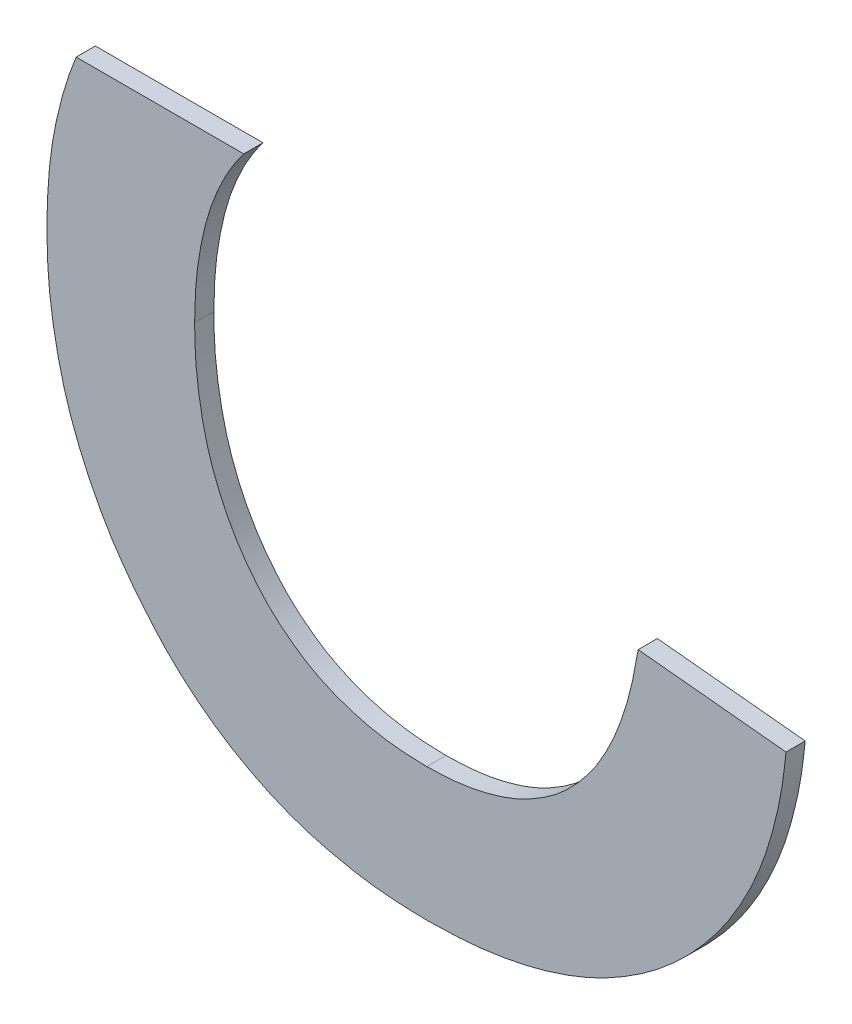
ISO-10303-21;
HEADER;
FILE_DESCRIPTION(('STEP AP214'),'2;1');
FILE_NAME('part.step','',(''),(''),'','','');
FILE_SCHEMA(('AUTOMOTIVE_DESIGN { 1 0 10303 214 1 1 1 1 }'));
ENDSEC;
DATA;
#1=APPLICATION_CONTEXT('core data for automotive mechanical design processes');
#2=APPLICATION_PROTOCOL_DEFINITION('international standard','automotive_design',2000,#1);
#3=PRODUCT_CONTEXT('',#1,'mechanical');
#4=PRODUCT('Part','Part','',(#3));
#5=PRODUCT_RELATED_PRODUCT_CATEGORY('part','',(#4));
#6=PRODUCT_DEFINITION_FORMATION('','',#4);
#7=PRODUCT_DEFINITION_CONTEXT('part definition',#1,'design');
#8=PRODUCT_DEFINITION('design','',#6,#7);
#9=PRODUCT_DEFINITION_SHAPE('','',#8);
#10=(LENGTH_UNIT() NAMED_UNIT(*) SI_UNIT(.MILLI.,.METRE.));
#11=(NAMED_UNIT(*) PLANE_ANGLE_UNIT() SI_UNIT($,.RADIAN.));
#12=(NAMED_UNIT(*) SI_UNIT($,.STERADIAN.) SOLID_ANGLE_UNIT());
#13=UNCERTAINTY_MEASURE_WITH_UNIT(LENGTH_MEASURE(1.E-05),#10,'distance_accuracy_value','');
#14=(GEOMETRIC_REPRESENTATION_CONTEXT(3) GLOBAL_UNCERTAINTY_ASSIGNED_CONTEXT((#13)) GLOBAL_UNIT_ASSIGNED_CONTEXT((#10,
#11,#12)) REPRESENTATION_CONTEXT('',''));
#15=CARTESIAN_POINT('',(0.,0.,0.));
#16=DIRECTION('',(0.,0.,1.));
#17=DIRECTION('',(1.,0.,0.));
#18=AXIS2_PLACEMENT_3D('',#15,#16,#17);
#19=CARTESIAN_POINT('',(0.270432692307709,-11.9230769230769,0.5));
#20=CARTESIAN_POINT('',(0.0417624850556169,-11.917551587077,0.5));
#21=CARTESIAN_POINT('',(-0.405412068221499,-11.9067465517943,0.5));
#22=CARTESIAN_POINT('',(-1.05596633519065,-11.8153619044994,0.5));
#23=CARTESIAN_POINT('',(-1.67046752789383,-11.6646792082309,0.5));
#24=CARTESIAN_POINT('',(-2.24597535159053,-11.4538099684877,0.5));
#25=CARTESIAN_POINT('',(-2.78923651972976,-11.1915691177577,0.5));
#26=CARTESIAN_POINT('',(-3.2822286741977,-10.8520149861326,0.5));
#27=CARTESIAN_POINT('',(-3.75183246427989,-10.4703225904718,0.5));
#28=CARTESIAN_POINT('',(-4.16782877969731,-10.0152719997556,0.5));
#29=CARTESIAN_POINT('',(-4.54650230418646,-9.51987342113349,0.5));
#30=CARTESIAN_POINT('',(-4.87332602438313,-8.97912479930914,0.5));
#31=CARTESIAN_POINT('',(-5.14846542112891,-8.40061596912319,0.5));
#32=CARTESIAN_POINT('',(-5.38010272037981,-7.78445784138785,0.5));
#33=CARTESIAN_POINT('',(-5.55114996205856,-7.12713051853561,0.5));
#34=CARTESIAN_POINT('',(-5.67696902461543,-6.43213085657785,0.5));
#35=CARTESIAN_POINT('',(-5.75773984020727,-5.69901614006801,0.5));
#36=CARTESIAN_POINT('',(-5.76534614363091,-5.19652948922153,0.5));
#37=CARTESIAN_POINT('',(-5.76923076923075,-4.93990384615385,0.5));
#38=B_SPLINE_CURVE_WITH_KNOTS('',3,(#19,#20,#21,#22,#23,#24,#25,#26,#27,#28,#29,#30,#31,#32,#33,
#34,#35,#36,#37),.UNSPECIFIED.,.F.,.F.,(4,1,1,1,1,1,1,1,1,1,1,1,1,1,1,1,4),(0.,
0.065801037609473,0.128676795948973,0.188675874952433,0.247598436733894,0.304849420118827,
0.361785899282899,0.419522706368589,0.478681815420741,0.538769503044019,0.598799056013154,
0.660184281500679,0.722951530610966,0.787992689104874,0.855403768434473,0.926153061284004,1.),.UNSPECIFIED.);
#39=DIRECTION('',(0.,0.,-1.));
#40=VECTOR('',#39,1.);
#41=SURFACE_OF_LINEAR_EXTRUSION('',#38,#40);
#42=CARTESIAN_POINT('',(0.270432692307709,-11.9230769230769,0.));
#43=CARTESIAN_POINT('',(0.0417624850556169,-11.917551587077,0.));
#44=CARTESIAN_POINT('',(-0.405412068221499,-11.9067465517943,0.));
#45=CARTESIAN_POINT('',(-1.05596633519065,-11.8153619044994,0.));
#46=CARTESIAN_POINT('',(-1.67046752789383,-11.6646792082309,0.));
#47=CARTESIAN_POINT('',(-2.24597535159053,-11.4538099684877,0.));
#48=CARTESIAN_POINT('',(-2.78923651972976,-11.1915691177577,0.));
#49=CARTESIAN_POINT('',(-3.2822286741977,-10.8520149861326,0.));
#50=CARTESIAN_POINT('',(-3.75183246427989,-10.4703225904718,0.));
#51=CARTESIAN_POINT('',(-4.16782877969731,-10.0152719997556,0.));
#52=CARTESIAN_POINT('',(-4.54650230418646,-9.51987342113349,0.));
#53=CARTESIAN_POINT('',(-4.87332602438313,-8.97912479930914,0.));
#54=CARTESIAN_POINT('',(-5.14846542112891,-8.40061596912319,0.));
#55=CARTESIAN_POINT('',(-5.38010272037981,-7.78445784138785,0.));
#56=CARTESIAN_POINT('',(-5.55114996205856,-7.12713051853561,0.));
#57=CARTESIAN_POINT('',(-5.67696902461543,-6.43213085657785,0.));
#58=CARTESIAN_POINT('',(-5.75773984020727,-5.69901614006801,0.));
#59=CARTESIAN_POINT('',(-5.76534614363091,-5.19652948922153,0.));
#60=CARTESIAN_POINT('',(-5.76923076923075,-4.93990384615385,0.));
#61=B_SPLINE_CURVE_WITH_KNOTS('',3,(#42,#43,#44,#45,#46,#47,#48,#49,#50,#51,#52,#53,#54,#55,#56,
#57,#58,#59,#60),.UNSPECIFIED.,.F.,.F.,(4,1,1,1,1,1,1,1,1,1,1,1,1,1,1,1,4),(0.,
0.065801037609473,0.128676795948973,0.188675874952433,0.247598436733894,0.304849420118827,
0.361785899282899,0.419522706368589,0.478681815420741,0.538769503044019,0.598799056013154,
0.660184281500679,0.722951530610966,0.787992689104874,0.855403768434473,0.926153061284004,1.),.UNSPECIFIED.);
#62=CARTESIAN_POINT('',(0.270432692307709,-11.9230769230769,0.));
#63=VERTEX_POINT('',#62);
#64=CARTESIAN_POINT('',(-5.76923076923075,-4.93990384615385,0.));
#65=VERTEX_POINT('',#64);
#66=EDGE_CURVE('E133',#63,#65,#61,.T.);
#67=ORIENTED_EDGE('',*,*,#66,.T.);
#68=DIRECTION('',(0.,0.,-1.));
#69=VECTOR('',#68,1.);
#70=CARTESIAN_POINT('',(-5.76923076923075,-4.93990384615385,0.5));
#71=LINE('',#70,#69);
#72=CARTESIAN_POINT('',(-5.76923076923075,-4.93990384615385,0.5));
#73=VERTEX_POINT('',#72);
#74=EDGE_CURVE('E47',#73,#65,#71,.T.);
#75=ORIENTED_EDGE('',*,*,#74,.F.);
#76=CARTESIAN_POINT('',(0.270432692307709,-11.9230769230769,0.5));
#77=VERTEX_POINT('',#76);
#78=EDGE_CURVE('E120',#77,#73,#38,.T.);
#79=ORIENTED_EDGE('',*,*,#78,.F.);
#80=DIRECTION('',(0.,0.,-1.));
#81=VECTOR('',#80,1.);
#82=CARTESIAN_POINT('',(0.270432692307709,-11.9230769230769,0.5));
#83=LINE('',#82,#81);
#84=EDGE_CURVE('E139',#77,#63,#83,.T.);
#85=ORIENTED_EDGE('',*,*,#84,.T.);
#86=EDGE_LOOP('',(#67,#75,#79,#85));
#87=FACE_BOUND('',#86,.T.);
#88=ADVANCED_FACE('F39',(#87),#41,.F.);
#89=CARTESIAN_POINT('',(5.76923076923079,-6.53846153846154,0.5));
#90=CARTESIAN_POINT('',(5.73114780791335,-6.75517119915605,0.5));
#91=CARTESIAN_POINT('',(5.65707052531692,-7.17670519287129,0.5));
#92=CARTESIAN_POINT('',(5.51590807620132,-7.78688815181148,0.5));
#93=CARTESIAN_POINT('',(5.33257823763546,-8.35376517604529,0.5));
#94=CARTESIAN_POINT('',(5.12658698056486,-8.88224574438043,0.5));
#95=CARTESIAN_POINT('',(4.88173162002967,-9.36674183653039,0.5));
#96=CARTESIAN_POINT('',(4.61642880827824,-9.81490339234355,0.5));
#97=CARTESIAN_POINT('',(4.30355836171512,-10.2108220736664,0.5));
#98=CARTESIAN_POINT('',(3.97461709511748,-10.5752048009428,0.5));
#99=CARTESIAN_POINT('',(3.61357892053754,-10.8962904255207,0.5));
#100=CARTESIAN_POINT('',(3.21696008990652,-11.1669766839051,0.5));
#101=CARTESIAN_POINT('',(2.79582652860781,-11.4031340532196,0.5));
#102=CARTESIAN_POINT('',(2.34504898861967,-11.5964892154392,0.5));
#103=CARTESIAN_POINT('',(1.86393660085663,-11.7380150111599,0.5));
#104=CARTESIAN_POINT('',(1.35861264025595,-11.8499376195799,0.5));
#105=CARTESIAN_POINT('',(0.822570146584102,-11.9063348940974,0.5));
#106=CARTESIAN_POINT('',(0.456832011709617,-11.9174248833846,0.5));
#107=CARTESIAN_POINT('',(0.270432692307709,-11.9230769230769,0.5));
#108=B_SPLINE_CURVE_WITH_KNOTS('',3,(#89,#90,#91,#92,#93,#94,#95,#96,#97,#98,#99,#100,#101,#102,
#103,#104,#105,#106,#107),.UNSPECIFIED.,.F.,.F.,(4,1,1,1,1,1,1,1,1,1,1,1,1,1,1,1,4),(0.,
0.077361337118976,0.150479832280681,0.219977236852074,0.286680996862441,0.349678494185663,
0.410679625017485,0.469427113519291,0.526755701427129,0.583141980834837,0.638824427778626,
0.695263470403812,0.752695804898535,0.810849183334895,0.871356303636084,0.934436430984128,1.),.UNSPECIFIED.);
#109=DIRECTION('',(0.,0.,-1.));
#110=VECTOR('',#109,1.);
#111=SURFACE_OF_LINEAR_EXTRUSION('',#108,#110);
#112=CARTESIAN_POINT('',(5.76923076923079,-6.53846153846154,0.));
#113=CARTESIAN_POINT('',(5.73114780791335,-6.75517119915605,0.));
#114=CARTESIAN_POINT('',(5.65707052531692,-7.17670519287129,0.));
#115=CARTESIAN_POINT('',(5.51590807620132,-7.78688815181148,0.));
#116=CARTESIAN_POINT('',(5.33257823763546,-8.35376517604529,0.));
#117=CARTESIAN_POINT('',(5.12658698056486,-8.88224574438043,0.));
#118=CARTESIAN_POINT('',(4.88173162002967,-9.36674183653039,0.));
#119=CARTESIAN_POINT('',(4.61642880827824,-9.81490339234355,0.));
#120=CARTESIAN_POINT('',(4.30355836171512,-10.2108220736664,0.));
#121=CARTESIAN_POINT('',(3.97461709511748,-10.5752048009428,0.));
#122=CARTESIAN_POINT('',(3.61357892053754,-10.8962904255207,0.));
#123=CARTESIAN_POINT('',(3.21696008990652,-11.1669766839051,0.));
#124=CARTESIAN_POINT('',(2.79582652860781,-11.4031340532196,0.));
#125=CARTESIAN_POINT('',(2.34504898861967,-11.5964892154392,0.));
#126=CARTESIAN_POINT('',(1.86393660085663,-11.7380150111599,0.));
#127=CARTESIAN_POINT('',(1.35861264025595,-11.8499376195799,0.));
#128=CARTESIAN_POINT('',(0.822570146584102,-11.9063348940974,0.));
#129=CARTESIAN_POINT('',(0.456832011709617,-11.9174248833846,0.));
#130=CARTESIAN_POINT('',(0.270432692307709,-11.9230769230769,0.));
#131=B_SPLINE_CURVE_WITH_KNOTS('',3,(#112,#113,#114,#115,#116,#117,#118,#119,#120,#121,#122,
#123,#124,#125,#126,#127,#128,#129,#130),.UNSPECIFIED.,.F.,.F.,(4,1,1,1,1,1,1,1,1,1,1,1,1,1,1,1,
4),(0.,0.077361337118976,0.150479832280681,0.219977236852074,0.286680996862441,
0.349678494185663,0.410679625017485,0.469427113519291,0.526755701427129,0.583141980834837,
0.638824427778626,0.695263470403812,0.752695804898535,0.810849183334895,0.871356303636084,
0.934436430984128,1.),.UNSPECIFIED.);
#132=CARTESIAN_POINT('',(5.76923076923079,-6.53846153846154,0.));
#133=VERTEX_POINT('',#132);
#134=EDGE_CURVE('E141',#133,#63,#131,.T.);
#135=ORIENTED_EDGE('',*,*,#134,.T.);
#136=ORIENTED_EDGE('',*,*,#84,.F.);
#137=CARTESIAN_POINT('',(5.76923076923079,-6.53846153846154,0.5));
#138=VERTEX_POINT('',#137);
#139=EDGE_CURVE('E215',#138,#77,#108,.T.);
#140=ORIENTED_EDGE('',*,*,#139,.F.);
#141=DIRECTION('',(0.,0.,-1.));
#142=VECTOR('',#141,1.);
#143=CARTESIAN_POINT('',(5.76923076923079,-6.53846153846154,0.5));
#144=LINE('',#143,#142);
#145=EDGE_CURVE('E149',#138,#133,#144,.T.);
#146=ORIENTED_EDGE('',*,*,#145,.T.);
#147=EDGE_LOOP('',(#135,#136,#140,#146));
#148=FACE_BOUND('',#147,.T.);
#149=ADVANCED_FACE('F199',(#148),#111,.F.);
#150=CARTESIAN_POINT('',(9.61538461538463,-6.92307692307692,0.5));
#151=DIRECTION('',(-0.0995037190209988,-0.995037190209989,0.));
#152=DIRECTION('',(0.995037190209989,-0.0995037190209988,0.));
#153=AXIS2_PLACEMENT_3D('',#150,#151,#152);
#154=PLANE('',#153);
#155=DIRECTION('',(-0.995037190209989,0.0995037190209988,0.));
#156=VECTOR('',#155,1.);
#157=CARTESIAN_POINT('',(9.61538461538463,-6.92307692307692,0.));
#158=LINE('',#157,#156);
#159=CARTESIAN_POINT('',(9.61538461538463,-6.92307692307692,0.));
#160=VERTEX_POINT('',#159);
#161=EDGE_CURVE('E146',#160,#133,#158,.T.);
#162=ORIENTED_EDGE('',*,*,#161,.T.);
#163=ORIENTED_EDGE('',*,*,#145,.F.);
#164=DIRECTION('',(-0.995037190209989,0.0995037190209988,0.));
#165=VECTOR('',#164,1.);
#166=CARTESIAN_POINT('',(9.61538461538463,-6.92307692307692,0.5));
#167=LINE('',#166,#165);
#168=CARTESIAN_POINT('',(9.61538461538463,-6.92307692307692,0.5));
#169=VERTEX_POINT('',#168);
#170=EDGE_CURVE('E226',#169,#138,#167,.T.);
#171=ORIENTED_EDGE('',*,*,#170,.F.);
#172=DIRECTION('',(0.,0.,-1.));
#173=VECTOR('',#172,1.);
#174=CARTESIAN_POINT('',(9.61538461538463,-6.92307692307692,0.5));
#175=LINE('',#174,#173);
#176=EDGE_CURVE('E151',#169,#160,#175,.T.);
#177=ORIENTED_EDGE('',*,*,#176,.T.);
#178=EDGE_LOOP('',(#162,#163,#171,#177));
#179=FACE_BOUND('',#178,.T.);
#180=ADVANCED_FACE('F204',(#179),#154,.F.);
#181=CARTESIAN_POINT('',(0.29447115384617,-15.3846153846154,0.5));
#182=CARTESIAN_POINT('',(0.61731387141956,-15.3780665727163,0.5));
#183=CARTESIAN_POINT('',(1.24885903131316,-15.3652557820967,0.5));
#184=CARTESIAN_POINT('',(2.17355351170966,-15.2538848362444,0.5));
#185=CARTESIAN_POINT('',(3.05304730892502,-15.0762874483541,0.5));
#186=CARTESIAN_POINT('',(3.88761595397978,-14.8215578161983,0.5));
#187=CARTESIAN_POINT('',(4.67977377825226,-14.4996830873233,0.5));
#188=CARTESIAN_POINT('',(5.42031297856914,-14.090791812185,0.5));
#189=CARTESIAN_POINT('',(6.12208481478024,-13.6230456610166,0.5));
#190=CARTESIAN_POINT('',(6.76965264526119,-13.0820334611229,0.5));
#191=CARTESIAN_POINT('',(7.35967125324576,-12.4785968679024,0.5));
#192=CARTESIAN_POINT('',(7.88833990873537,-11.8255214022307,0.5));
#193=CARTESIAN_POINT('',(8.34850428445516,-11.1223812112496,0.5));
#194=CARTESIAN_POINT('',(8.7399422827429,-10.3733837299701,0.5));
#195=CARTESIAN_POINT('',(9.06618777879945,-9.57924726779194,0.5));
#196=CARTESIAN_POINT('',(9.31577848213798,-8.73455154014438,0.5));
#197=CARTESIAN_POINT('',(9.51347508967043,-7.84758431312007,0.5));
#198=CARTESIAN_POINT('',(9.58105859121429,-7.23447728328738,0.5));
#199=CARTESIAN_POINT('',(9.61538461538463,-6.92307692307693,0.5));
#200=B_SPLINE_CURVE_WITH_KNOTS('',3,(#181,#182,#183,#184,#185,#186,#187,#188,#189,#190,#191,
#192,#193,#194,#195,#196,#197,#198,#199),.UNSPECIFIED.,.F.,.F.,(4,1,1,1,1,1,1,1,1,1,1,1,1,1,1,1,
4),(0.,0.0692980234597532,0.135560844101282,0.199670955647057,0.261716238495609,
0.322661929947103,0.382906923778225,0.443032033072891,0.503500787350163,0.563724281017108,
0.623980022053474,0.683629386995523,0.743848272485731,0.80519184622951,0.867648742959767,
0.932778084231261,1.),.UNSPECIFIED.);
#201=DIRECTION('',(0.,0.,-1.));
#202=VECTOR('',#201,1.);
#203=SURFACE_OF_LINEAR_EXTRUSION('',#200,#202);
#204=CARTESIAN_POINT('',(0.29447115384617,-15.3846153846154,0.));
#205=CARTESIAN_POINT('',(0.61731387141956,-15.3780665727163,0.));
#206=CARTESIAN_POINT('',(1.24885903131316,-15.3652557820967,0.));
#207=CARTESIAN_POINT('',(2.17355351170966,-15.2538848362444,0.));
#208=CARTESIAN_POINT('',(3.05304730892502,-15.0762874483541,0.));
#209=CARTESIAN_POINT('',(3.88761595397978,-14.8215578161983,0.));
#210=CARTESIAN_POINT('',(4.67977377825226,-14.4996830873233,0.));
#211=CARTESIAN_POINT('',(5.42031297856914,-14.090791812185,0.));
#212=CARTESIAN_POINT('',(6.12208481478024,-13.6230456610166,0.));
#213=CARTESIAN_POINT('',(6.76965264526119,-13.0820334611229,0.));
#214=CARTESIAN_POINT('',(7.35967125324576,-12.4785968679024,0.));
#215=CARTESIAN_POINT('',(7.88833990873537,-11.8255214022307,0.));
#216=CARTESIAN_POINT('',(8.34850428445516,-11.1223812112496,0.));
#217=CARTESIAN_POINT('',(8.7399422827429,-10.3733837299701,0.));
#218=CARTESIAN_POINT('',(9.06618777879945,-9.57924726779194,0.));
#219=CARTESIAN_POINT('',(9.31577848213798,-8.73455154014438,0.));
#220=CARTESIAN_POINT('',(9.51347508967043,-7.84758431312007,0.));
#221=CARTESIAN_POINT('',(9.58105859121429,-7.23447728328738,0.));
#222=CARTESIAN_POINT('',(9.61538461538463,-6.92307692307693,0.));
#223=B_SPLINE_CURVE_WITH_KNOTS('',3,(#204,#205,#206,#207,#208,#209,#210,#211,#212,#213,#214,
#215,#216,#217,#218,#219,#220,#221,#222),.UNSPECIFIED.,.F.,.F.,(4,1,1,1,1,1,1,1,1,1,1,1,1,1,1,1,
4),(0.,0.0692980234597532,0.135560844101282,0.199670955647057,0.261716238495609,
0.322661929947103,0.382906923778225,0.443032033072891,0.503500787350163,0.563724281017108,
0.623980022053474,0.683629386995523,0.743848272485731,0.80519184622951,0.867648742959767,
0.932778084231261,1.),.UNSPECIFIED.);
#224=CARTESIAN_POINT('',(0.294471153846169,-15.3846153846154,0.));
#225=VERTEX_POINT('',#224);
#226=EDGE_CURVE('E153',#225,#160,#223,.T.);
#227=ORIENTED_EDGE('',*,*,#226,.T.);
#228=ORIENTED_EDGE('',*,*,#176,.F.);
#229=CARTESIAN_POINT('',(0.294471153846169,-15.3846153846154,0.5));
#230=VERTEX_POINT('',#229);
#231=EDGE_CURVE('E170',#230,#169,#200,.T.);
#232=ORIENTED_EDGE('',*,*,#231,.F.);
#233=DIRECTION('',(0.,0.,-1.));
#234=VECTOR('',#233,1.);
#235=CARTESIAN_POINT('',(0.294471153846169,-15.3846153846154,0.5));
#236=LINE('',#235,#234);
#237=EDGE_CURVE('E158',#230,#225,#236,.T.);
#238=ORIENTED_EDGE('',*,*,#237,.T.);
#239=EDGE_LOOP('',(#227,#228,#232,#238));
#240=FACE_BOUND('',#239,.T.);
#241=ADVANCED_FACE('F182',(#240),#203,.F.);
#242=CARTESIAN_POINT('',(-7.31971153846152,-11.7427884615385,0.5));
#243=CARTESIAN_POINT('',(-7.08405216502034,-12.0333533217631,0.5));
#244=CARTESIAN_POINT('',(-6.62048487621668,-12.604925597922,0.5));
#245=CARTESIAN_POINT('',(-5.81782317590183,-13.3467922023177,0.5));
#246=CARTESIAN_POINT('',(-4.95495046796258,-13.977276717126,0.5));
#247=CARTESIAN_POINT('',(-4.0267316921085,-14.4894996933801,0.5));
#248=CARTESIAN_POINT('',(-3.03939828138436,-14.9011142294698,0.5));
#249=CARTESIAN_POINT('',(-1.98082111549329,-15.1750282472766,0.5));
#250=CARTESIAN_POINT('',(-0.863791278364023,-15.3589723601052,0.5));
#251=CARTESIAN_POINT('',(-0.0969286227070843,-15.3759500996296,0.5));
#252=CARTESIAN_POINT('',(0.294471153846169,-15.3846153846154,0.5));
#253=B_SPLINE_CURVE_WITH_KNOTS('',3,(#242,#243,#244,#245,#246,#247,#248,#249,#250,#251,#252),
.UNSPECIFIED.,.F.,.F.,(4,1,1,1,1,1,1,1,4),(0.,0.127892619465421,0.251578513503857,
0.372792819702304,0.492777698607854,0.613590069242572,0.737808649280146,0.866179901539168,1.),.UNSPECIFIED.);
#254=DIRECTION('',(0.,0.,-1.));
#255=VECTOR('',#254,1.);
#256=SURFACE_OF_LINEAR_EXTRUSION('',#253,#255);
#257=CARTESIAN_POINT('',(-7.31971153846152,-11.7427884615385,0.));
#258=CARTESIAN_POINT('',(-7.08405216502034,-12.0333533217631,0.));
#259=CARTESIAN_POINT('',(-6.62048487621668,-12.604925597922,0.));
#260=CARTESIAN_POINT('',(-5.81782317590183,-13.3467922023177,0.));
#261=CARTESIAN_POINT('',(-4.95495046796258,-13.977276717126,0.));
#262=CARTESIAN_POINT('',(-4.0267316921085,-14.4894996933801,0.));
#263=CARTESIAN_POINT('',(-3.03939828138436,-14.9011142294698,0.));
#264=CARTESIAN_POINT('',(-1.98082111549329,-15.1750282472766,0.));
#265=CARTESIAN_POINT('',(-0.863791278364023,-15.3589723601052,0.));
#266=CARTESIAN_POINT('',(-0.0969286227070843,-15.3759500996296,0.));
#267=CARTESIAN_POINT('',(0.294471153846169,-15.3846153846154,0.));
#268=B_SPLINE_CURVE_WITH_KNOTS('',3,(#257,#258,#259,#260,#261,#262,#263,#264,#265,#266,#267),
.UNSPECIFIED.,.F.,.F.,(4,1,1,1,1,1,1,1,4),(0.,0.127892619465421,0.251578513503857,
0.372792819702304,0.492777698607854,0.613590069242572,0.737808649280146,0.866179901539168,1.),.UNSPECIFIED.);
#269=CARTESIAN_POINT('',(-7.31971153846152,-11.7427884615385,0.));
#270=VERTEX_POINT('',#269);
#271=EDGE_CURVE('E272',#270,#225,#268,.T.);
#272=ORIENTED_EDGE('',*,*,#271,.T.);
#273=ORIENTED_EDGE('',*,*,#237,.F.);
#274=CARTESIAN_POINT('',(-7.31971153846152,-11.7427884615385,0.5));
#275=VERTEX_POINT('',#274);
#276=EDGE_CURVE('E162',#275,#230,#253,.T.);
#277=ORIENTED_EDGE('',*,*,#276,.F.);
#278=DIRECTION('',(0.,0.,-1.));
#279=VECTOR('',#278,1.);
#280=CARTESIAN_POINT('',(-7.31971153846152,-11.7427884615385,0.5));
#281=LINE('',#280,#279);
#282=EDGE_CURVE('E271',#275,#270,#281,.T.);
#283=ORIENTED_EDGE('',*,*,#282,.T.);
#284=EDGE_LOOP('',(#272,#273,#277,#283));
#285=FACE_BOUND('',#284,.T.);
#286=ADVANCED_FACE('F177',(#285),#256,.F.);
#287=CARTESIAN_POINT('',(-9.6153846153846,-4.71153846153846,0.5));
#288=CARTESIAN_POINT('',(-9.60857463018898,-5.04435423593501,0.5));
#289=CARTESIAN_POINT('',(-9.59512296624039,-5.70176035729509,0.5));
#290=CARTESIAN_POINT('',(-9.48488379805219,-6.67056980722342,0.5));
#291=CARTESIAN_POINT('',(-9.30329096780913,-7.60409396778952,0.5));
#292=CARTESIAN_POINT('',(-9.06018827641446,-8.50509729113863,0.5));
#293=CARTESIAN_POINT('',(-8.73172391614789,-9.36846277539103,0.5));
#294=CARTESIAN_POINT('',(-8.3333273914149,-10.1969791610731,0.5));
#295=CARTESIAN_POINT('',(-7.87375465390775,-10.9992917361114,0.5));
#296=CARTESIAN_POINT('',(-7.50520116776095,-11.493871133374,0.5));
#297=CARTESIAN_POINT('',(-7.31971153846152,-11.7427884615385,0.5));
#298=B_SPLINE_CURVE_WITH_KNOTS('',3,(#287,#288,#289,#290,#291,#292,#293,#294,#295,#296,#297),
.UNSPECIFIED.,.F.,.F.,(4,1,1,1,1,1,1,1,4),(0.,0.132461622242638,0.26164950103549,
0.387546698416366,0.510781629293347,0.632675360599711,0.754660354138138,0.876522779802865,1.),.UNSPECIFIED.);
#299=DIRECTION('',(0.,0.,-1.));
#300=VECTOR('',#299,1.);
#301=SURFACE_OF_LINEAR_EXTRUSION('',#298,#300);
#302=CARTESIAN_POINT('',(-9.6153846153846,-4.71153846153846,0.));
#303=CARTESIAN_POINT('',(-9.60857463018898,-5.04435423593501,0.));
#304=CARTESIAN_POINT('',(-9.59512296624039,-5.70176035729509,0.));
#305=CARTESIAN_POINT('',(-9.48488379805219,-6.67056980722342,0.));
#306=CARTESIAN_POINT('',(-9.30329096780913,-7.60409396778952,0.));
#307=CARTESIAN_POINT('',(-9.06018827641446,-8.50509729113863,0.));
#308=CARTESIAN_POINT('',(-8.73172391614789,-9.36846277539103,0.));
#309=CARTESIAN_POINT('',(-8.3333273914149,-10.1969791610731,0.));
#310=CARTESIAN_POINT('',(-7.87375465390775,-10.9992917361114,0.));
#311=CARTESIAN_POINT('',(-7.50520116776095,-11.493871133374,0.));
#312=CARTESIAN_POINT('',(-7.31971153846152,-11.7427884615385,0.));
#313=B_SPLINE_CURVE_WITH_KNOTS('',3,(#302,#303,#304,#305,#306,#307,#308,#309,#310,#311,#312),
.UNSPECIFIED.,.F.,.F.,(4,1,1,1,1,1,1,1,4),(0.,0.132461622242638,0.26164950103549,
0.387546698416366,0.510781629293347,0.632675360599711,0.754660354138138,0.876522779802865,1.),.UNSPECIFIED.);
#314=CARTESIAN_POINT('',(-9.6153846153846,-4.71153846153846,0.));
#315=VERTEX_POINT('',#314);
#316=EDGE_CURVE('E122',#315,#270,#313,.T.);
#317=ORIENTED_EDGE('',*,*,#316,.T.);
#318=ORIENTED_EDGE('',*,*,#282,.F.);
#319=CARTESIAN_POINT('',(-9.6153846153846,-4.71153846153846,0.5));
#320=VERTEX_POINT('',#319);
#321=EDGE_CURVE('E169',#320,#275,#298,.T.);
#322=ORIENTED_EDGE('',*,*,#321,.F.);
#323=DIRECTION('',(0.,0.,-1.));
#324=VECTOR('',#323,1.);
#325=CARTESIAN_POINT('',(-9.6153846153846,-4.71153846153846,0.5));
#326=LINE('',#325,#324);
#327=EDGE_CURVE('E267',#320,#315,#326,.T.);
#328=ORIENTED_EDGE('',*,*,#327,.T.);
#329=EDGE_LOOP('',(#317,#318,#322,#328));
#330=FACE_BOUND('',#329,.T.);
#331=ADVANCED_FACE('F183',(#330),#301,.F.);
#332=CARTESIAN_POINT('',(6.72479436320556,-13.1040360063183,0.5));
#333=DIRECTION('',(0.,0.,-1.));
#334=DIRECTION('',(-1.,0.,0.));
#335=AXIS2_PLACEMENT_3D('',#332,#333,#334);
#336=PLANE('',#335);
#337=CARTESIAN_POINT('',(-5.76923076923075,-4.93990384615385,0.5));
#338=CARTESIAN_POINT('',(-5.76481556671325,-4.69534295230196,0.5));
#339=CARTESIAN_POINT('',(-5.75621814341022,-4.21912617187611,0.5));
#340=CARTESIAN_POINT('',(-5.68381381272763,-3.52567536035832,0.5));
#341=CARTESIAN_POINT('',(-5.56165918279042,-2.87362173974889,0.5));
#342=CARTESIAN_POINT('',(-5.40360252933254,-2.25577854103315,0.5));
#343=CARTESIAN_POINT('',(-5.18574136819858,-1.68180032511622,0.5));
#344=CARTESIAN_POINT('',(-4.92734576377249,-1.14336496905831,0.5));
#345=CARTESIAN_POINT('',(-4.61080028837524,-0.651899656303548,0.5));
#346=CARTESIAN_POINT('',(-4.25862255894378,-0.192101936840787,0.5));
#347=CARTESIAN_POINT('',(-3.85639112961883,0.220088191438074,0.5));
#348=CARTESIAN_POINT('',(-3.39867192137992,0.568130547046922,0.5));
#349=CARTESIAN_POINT('',(-2.9034209885128,0.872737896042509,0.5));
#350=CARTESIAN_POINT('',(-2.3606634698756,1.11975545357985,0.5));
#351=CARTESIAN_POINT('',(-1.77007976351094,1.30328021662253,0.5));
#352=CARTESIAN_POINT('',(-1.13753864408726,1.44448600800401,0.5));
#353=CARTESIAN_POINT('',(-0.456476560536233,1.51875447221429,0.5));
#354=CARTESIAN_POINT('',(0.0118653544143888,1.53177450360067,0.5));
#355=CARTESIAN_POINT('',(0.252403846153862,1.53846153846154,0.5));
#356=B_SPLINE_CURVE_WITH_KNOTS('',3,(#337,#338,#339,#340,#341,#342,#343,#344,#345,#346,#347,
#348,#349,#350,#351,#352,#353,#354,#355),.UNSPECIFIED.,.F.,.F.,(4,1,1,1,1,1,1,1,1,1,1,1,1,1,1,1,
4),(0.,0.0728659334565352,0.141886871964126,0.207452626414711,0.270437680000097,
0.331640872247669,0.390107577493158,0.448069286948836,0.505502951924537,0.562488152833724,
0.619084328884729,0.676415530692239,0.735452360450793,0.796240769448678,0.860405678089203,
0.928304927285106,1.),.UNSPECIFIED.);
#357=CARTESIAN_POINT('',(-4.49097708819802,-0.5,0.5));
#358=VERTEX_POINT('',#357);
#359=EDGE_CURVE('E214',#73,#358,#356,.T.);
#360=ORIENTED_EDGE('',*,*,#359,.T.);
#361=DIRECTION('',(-1.,0.,0.));
#362=VECTOR('',#361,1.);
#363=CARTESIAN_POINT('',(6.72479436320556,-0.5,0.5));
#364=LINE('',#363,#362);
#365=CARTESIAN_POINT('',(-8.85094215065557,-0.499999999585352,0.5));
#366=VERTEX_POINT('',#365);
#367=EDGE_CURVE('E476',#358,#366,#364,.T.);
#368=ORIENTED_EDGE('',*,*,#367,.T.);
#369=CARTESIAN_POINT('',(-0.81129807692306,5.,0.5));
#370=CARTESIAN_POINT('',(-1.1141988645718,4.99206375907898,0.5));
#371=CARTESIAN_POINT('',(-1.71068397645657,4.9764353759689,0.5));
#372=CARTESIAN_POINT('',(-2.58962544260301,4.8480285306234,0.5));
#373=CARTESIAN_POINT('',(-3.43004133811339,4.63004939817371,0.5));
#374=CARTESIAN_POINT('',(-4.2385238149774,4.336463286216,0.5));
#375=CARTESIAN_POINT('',(-5.00441208821668,3.94726474256061,0.5));
#376=CARTESIAN_POINT('',(-5.73546405515526,3.47602794776569,0.5));
#377=CARTESIAN_POINT('',(-6.42872820607369,2.91886862879422,0.5));
#378=CARTESIAN_POINT('',(-7.08028531926996,2.2862992321744,0.5));
#379=CARTESIAN_POINT('',(-7.67127353299072,1.58408070090461,0.5));
#380=CARTESIAN_POINT('',(-8.20022727277801,0.835114931584709,0.5));
#381=CARTESIAN_POINT('',(-8.63224779451468,0.0244096904560783,0.5));
#382=CARTESIAN_POINT('',(-8.99560670429197,-0.826867370101214,0.5));
#383=CARTESIAN_POINT('',(-9.26965977427216,-1.73269027221245,0.5));
#384=CARTESIAN_POINT('',(-9.477675619546,-2.68020353887867,0.5));
#385=CARTESIAN_POINT('',(-9.58889478622745,-3.68125324903562,0.5));
#386=CARTESIAN_POINT('',(-9.60641647528384,-4.36273507459891,0.5));
#387=CARTESIAN_POINT('',(-9.6153846153846,-4.71153846153846,0.5));
#388=B_SPLINE_CURVE_WITH_KNOTS('',3,(#369,#370,#371,#372,#373,#374,#375,#376,#377,#378,#379,
#380,#381,#382,#383,#384,#385,#386,#387),.UNSPECIFIED.,.F.,.F.,(4,1,1,1,1,1,1,1,1,1,1,1,1,1,1,1,
4),(0.,0.061997419075722,0.122087954082293,0.181375310787003,0.239508008395366,
0.297835697896751,0.356879970653118,0.417281825115428,0.479640409079816,0.542500067478357,
0.60496241964819,0.666991033078265,0.730216243010164,0.794172863251256,0.860458143150261,
0.928578179984783,1.),.UNSPECIFIED.);
#389=EDGE_CURVE('E119',#366,#320,#388,.T.);
#390=ORIENTED_EDGE('',*,*,#389,.T.);
#391=ORIENTED_EDGE('',*,*,#321,.T.);
#392=ORIENTED_EDGE('',*,*,#276,.T.);
#393=ORIENTED_EDGE('',*,*,#231,.T.);
#394=ORIENTED_EDGE('',*,*,#170,.T.);
#395=ORIENTED_EDGE('',*,*,#139,.T.);
#396=ORIENTED_EDGE('',*,*,#78,.T.);
#397=EDGE_LOOP('',(#360,#368,#390,#391,#392,#393,#394,#395,#396));
#398=FACE_BOUND('',#397,.T.);
#399=ADVANCED_FACE('F190',(#398),#336,.F.);
#400=DIRECTION('',(0.,0.,-1.));
#401=VECTOR('',#400,1.);
#402=SURFACE_OF_LINEAR_EXTRUSION('',#388,#401);
#403=ORIENTED_EDGE('',*,*,#389,.F.);
#404=DIRECTION('',(0.,0.,-1.));
#405=VECTOR('',#404,1.);
#406=CARTESIAN_POINT('',(-8.85094215082548,-0.5,0.5));
#407=LINE('',#406,#405);
#408=CARTESIAN_POINT('',(-8.85094215082548,-0.5,0.));
#409=VERTEX_POINT('',#408);
#410=EDGE_CURVE('E101',#366,#409,#407,.T.);
#411=ORIENTED_EDGE('',*,*,#410,.T.);
#412=CARTESIAN_POINT('',(-0.81129807692306,5.,0.));
#413=CARTESIAN_POINT('',(-1.1141988645718,4.99206375907898,0.));
#414=CARTESIAN_POINT('',(-1.71068397645657,4.9764353759689,0.));
#415=CARTESIAN_POINT('',(-2.58962544260301,4.8480285306234,0.));
#416=CARTESIAN_POINT('',(-3.43004133811339,4.63004939817371,0.));
#417=CARTESIAN_POINT('',(-4.2385238149774,4.336463286216,0.));
#418=CARTESIAN_POINT('',(-5.00441208821668,3.94726474256061,0.));
#419=CARTESIAN_POINT('',(-5.73546405515526,3.47602794776569,0.));
#420=CARTESIAN_POINT('',(-6.42872820607369,2.91886862879422,0.));
#421=CARTESIAN_POINT('',(-7.08028531926996,2.2862992321744,0.));
#422=CARTESIAN_POINT('',(-7.67127353299072,1.58408070090461,0.));
#423=CARTESIAN_POINT('',(-8.20022727277801,0.835114931584709,0.));
#424=CARTESIAN_POINT('',(-8.63224779451468,0.0244096904560783,0.));
#425=CARTESIAN_POINT('',(-8.99560670429197,-0.826867370101214,0.));
#426=CARTESIAN_POINT('',(-9.26965977427216,-1.73269027221245,0.));
#427=CARTESIAN_POINT('',(-9.477675619546,-2.68020353887867,0.));
#428=CARTESIAN_POINT('',(-9.58889478622745,-3.68125324903562,0.));
#429=CARTESIAN_POINT('',(-9.60641647528384,-4.36273507459891,0.));
#430=CARTESIAN_POINT('',(-9.6153846153846,-4.71153846153846,0.));
#431=B_SPLINE_CURVE_WITH_KNOTS('',3,(#412,#413,#414,#415,#416,#417,#418,#419,#420,#421,#422,
#423,#424,#425,#426,#427,#428,#429,#430),.UNSPECIFIED.,.F.,.F.,(4,1,1,1,1,1,1,1,1,1,1,1,1,1,1,1,
4),(0.,0.061997419075722,0.122087954082293,0.181375310787003,0.239508008395366,
0.297835697896751,0.356879970653118,0.417281825115428,0.479640409079816,0.542500067478357,
0.60496241964819,0.666991033078265,0.730216243010164,0.794172863251256,0.860458143150261,
0.928578179984783,1.),.UNSPECIFIED.);
#432=EDGE_CURVE('E113',#409,#315,#431,.T.);
#433=ORIENTED_EDGE('',*,*,#432,.T.);
#434=ORIENTED_EDGE('',*,*,#327,.F.);
#435=EDGE_LOOP('',(#403,#411,#433,#434));
#436=FACE_BOUND('',#435,.T.);
#437=ADVANCED_FACE('F111',(#436),#402,.F.);
#438=DIRECTION('',(0.,0.,-1.));
#439=VECTOR('',#438,1.);
#440=SURFACE_OF_LINEAR_EXTRUSION('',#356,#439);
#441=CARTESIAN_POINT('',(-5.76923076923075,-4.93990384615385,0.));
#442=CARTESIAN_POINT('',(-5.76481556671325,-4.69534295230196,0.));
#443=CARTESIAN_POINT('',(-5.75621814341022,-4.21912617187611,0.));
#444=CARTESIAN_POINT('',(-5.68381381272763,-3.52567536035832,0.));
#445=CARTESIAN_POINT('',(-5.56165918279042,-2.87362173974889,0.));
#446=CARTESIAN_POINT('',(-5.40360252933254,-2.25577854103315,0.));
#447=CARTESIAN_POINT('',(-5.18574136819858,-1.68180032511622,0.));
#448=CARTESIAN_POINT('',(-4.92734576377249,-1.14336496905831,0.));
#449=CARTESIAN_POINT('',(-4.61080028837524,-0.651899656303548,0.));
#450=CARTESIAN_POINT('',(-4.25862255894378,-0.192101936840787,0.));
#451=CARTESIAN_POINT('',(-3.85639112961883,0.220088191438074,0.));
#452=CARTESIAN_POINT('',(-3.39867192137992,0.568130547046922,0.));
#453=CARTESIAN_POINT('',(-2.9034209885128,0.872737896042509,0.));
#454=CARTESIAN_POINT('',(-2.3606634698756,1.11975545357985,0.));
#455=CARTESIAN_POINT('',(-1.77007976351094,1.30328021662253,0.));
#456=CARTESIAN_POINT('',(-1.13753864408726,1.44448600800401,0.));
#457=CARTESIAN_POINT('',(-0.456476560536233,1.51875447221429,0.));
#458=CARTESIAN_POINT('',(0.0118653544143888,1.53177450360067,0.));
#459=CARTESIAN_POINT('',(0.252403846153862,1.53846153846154,0.));
#460=B_SPLINE_CURVE_WITH_KNOTS('',3,(#441,#442,#443,#444,#445,#446,#447,#448,#449,#450,#451,
#452,#453,#454,#455,#456,#457,#458,#459),.UNSPECIFIED.,.F.,.F.,(4,1,1,1,1,1,1,1,1,1,1,1,1,1,1,1,
4),(0.,0.0728659334565352,0.141886871964126,0.207452626414711,0.270437680000097,
0.331640872247669,0.390107577493158,0.448069286948836,0.505502951924537,0.562488152833724,
0.619084328884729,0.676415530692239,0.735452360450793,0.796240769448678,0.860405678089203,
0.928304927285106,1.),.UNSPECIFIED.);
#461=CARTESIAN_POINT('',(-4.49115074082335,-0.5,-1.2E-05));
#462=VERTEX_POINT('',#461);
#463=EDGE_CURVE('E121',#65,#462,#460,.T.);
#464=ORIENTED_EDGE('',*,*,#463,.T.);
#465=DIRECTION('',(0.,0.,-1.));
#466=VECTOR('',#465,1.);
#467=CARTESIAN_POINT('',(-4.4909770891839,-0.5,0.5));
#468=LINE('',#467,#466);
#469=EDGE_CURVE('E54',#462,#358,#468,.F.);
#470=ORIENTED_EDGE('',*,*,#469,.T.);
#471=ORIENTED_EDGE('',*,*,#359,.F.);
#472=ORIENTED_EDGE('',*,*,#74,.T.);
#473=EDGE_LOOP('',(#464,#470,#471,#472));
#474=FACE_BOUND('',#473,.T.);
#475=ADVANCED_FACE('F193',(#474),#440,.F.);
#476=CARTESIAN_POINT('',(6.72479436320556,-13.1040360063183,0.));
#477=DIRECTION('',(0.,0.,-1.));
#478=DIRECTION('',(-1.,0.,0.));
#479=AXIS2_PLACEMENT_3D('',#476,#477,#478);
#480=PLANE('',#479);
#481=DIRECTION('',(-1.,0.,0.));
#482=VECTOR('',#481,1.);
#483=CARTESIAN_POINT('',(6.72479436320556,-0.5,0.));
#484=LINE('',#483,#482);
#485=EDGE_CURVE('E11',#462,#409,#484,.T.);
#486=ORIENTED_EDGE('',*,*,#485,.F.);
#487=ORIENTED_EDGE('',*,*,#463,.F.);
#488=ORIENTED_EDGE('',*,*,#66,.F.);
#489=ORIENTED_EDGE('',*,*,#134,.F.);
#490=ORIENTED_EDGE('',*,*,#161,.F.);
#491=ORIENTED_EDGE('',*,*,#226,.F.);
#492=ORIENTED_EDGE('',*,*,#271,.F.);
#493=ORIENTED_EDGE('',*,*,#316,.F.);
#494=ORIENTED_EDGE('',*,*,#432,.F.);
#495=EDGE_LOOP('',(#486,#487,#488,#489,#490,#491,#492,#493,#494));
#496=FACE_BOUND('',#495,.T.);
#497=ADVANCED_FACE('F41',(#496),#480,.T.);
#498=CARTESIAN_POINT('',(-17.,-0.5,1.));
#499=DIRECTION('',(0.,-1.,0.));
#500=DIRECTION('',(0.,0.,-1.));
#501=AXIS2_PLACEMENT_3D('',#498,#499,#500);
#502=PLANE('',#501);
#503=ORIENTED_EDGE('',*,*,#485,.T.);
#504=ORIENTED_EDGE('',*,*,#410,.F.);
#505=ORIENTED_EDGE('',*,*,#367,.F.);
#506=ORIENTED_EDGE('',*,*,#469,.F.);
#507=EDGE_LOOP('',(#503,#504,#505,#506));
#508=FACE_BOUND('',#507,.T.);
#509=ADVANCED_FACE('F107',(#508),#502,.F.);
#510=CLOSED_SHELL('',(#88,#149,#180,#241,#286,#331,#399,#437,#475,#497,#509));
#511=MANIFOLD_SOLID_BREP('B2',#510);
#512=ADVANCED_BREP_SHAPE_REPRESENTATION('',(#18,#511),#14);
#513=SHAPE_DEFINITION_REPRESENTATION(#9,#512);
ENDSEC;
END-ISO-10303-21;
